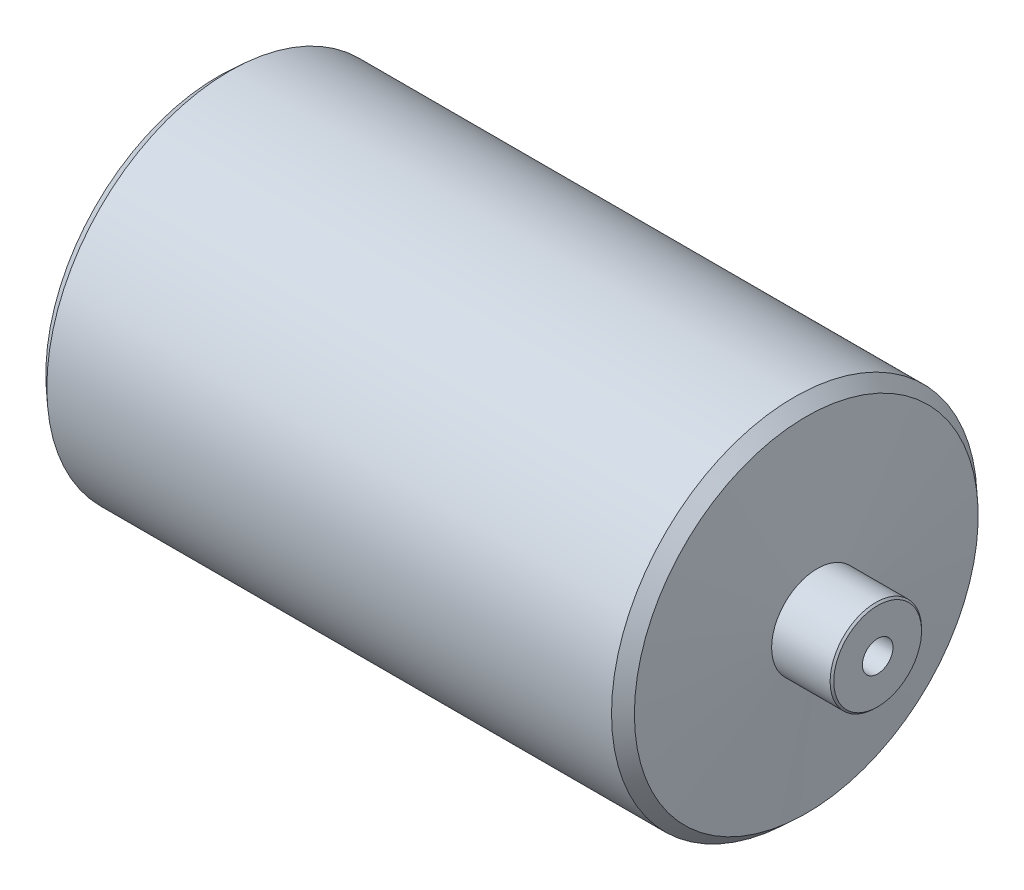
ISO-10303-21;
HEADER;
FILE_DESCRIPTION(('STEP AP214'),'2;1');
FILE_NAME('part.step','',(''),(''),'','','');
FILE_SCHEMA(('AUTOMOTIVE_DESIGN { 1 0 10303 214 1 1 1 1 }'));
ENDSEC;
DATA;
#1=APPLICATION_CONTEXT('core data for automotive mechanical design processes');
#2=APPLICATION_PROTOCOL_DEFINITION('international standard','automotive_design',2000,#1);
#3=PRODUCT_CONTEXT('',#1,'mechanical');
#4=PRODUCT('Part','Part','',(#3));
#5=PRODUCT_RELATED_PRODUCT_CATEGORY('part','',(#4));
#6=PRODUCT_DEFINITION_FORMATION('','',#4);
#7=PRODUCT_DEFINITION_CONTEXT('part definition',#1,'design');
#8=PRODUCT_DEFINITION('design','',#6,#7);
#9=PRODUCT_DEFINITION_SHAPE('','',#8);
#10=(LENGTH_UNIT() NAMED_UNIT(*) SI_UNIT(.MILLI.,.METRE.));
#11=(NAMED_UNIT(*) PLANE_ANGLE_UNIT() SI_UNIT($,.RADIAN.));
#12=(NAMED_UNIT(*) SI_UNIT($,.STERADIAN.) SOLID_ANGLE_UNIT());
#13=UNCERTAINTY_MEASURE_WITH_UNIT(LENGTH_MEASURE(1.E-05),#10,'distance_accuracy_value','');
#14=(GEOMETRIC_REPRESENTATION_CONTEXT(3) GLOBAL_UNCERTAINTY_ASSIGNED_CONTEXT((#13)) GLOBAL_UNIT_ASSIGNED_CONTEXT((#10,
#11,#12)) REPRESENTATION_CONTEXT('',''));
#15=CARTESIAN_POINT('',(0.,0.,0.));
#16=DIRECTION('',(0.,0.,1.));
#17=DIRECTION('',(1.,0.,0.));
#18=AXIS2_PLACEMENT_3D('',#15,#16,#17);
#19=CARTESIAN_POINT('',(0.,0.,0.));
#20=DIRECTION('',(1.,0.,0.));
#21=DIRECTION('',(0.,0.,-1.));
#22=AXIS2_PLACEMENT_3D('',#19,#20,#21);
#23=PLANE('',#22);
#24=CARTESIAN_POINT('',(0.,0.,0.));
#25=DIRECTION('',(-1.,0.,0.));
#26=DIRECTION('',(0.,0.,1.));
#27=AXIS2_PLACEMENT_3D('',#24,#25,#26);
#28=CIRCLE('',#27,4.188);
#29=CARTESIAN_POINT('',(0.,0.,4.188));
#30=VERTEX_POINT('',#29);
#31=EDGE_CURVE('E58',#30,#30,#28,.T.);
#32=ORIENTED_EDGE('',*,*,#31,.F.);
#33=EDGE_LOOP('',(#32));
#34=FACE_BOUND('',#33,.T.);
#35=CARTESIAN_POINT('',(0.,0.,0.));
#36=DIRECTION('',(1.,0.,0.));
#37=DIRECTION('',(0.,0.,-1.));
#38=AXIS2_PLACEMENT_3D('',#35,#36,#37);
#39=CIRCLE('',#38,12.);
#40=CARTESIAN_POINT('',(0.,0.,-12.));
#41=VERTEX_POINT('',#40);
#42=EDGE_CURVE('E41',#41,#41,#39,.F.);
#43=ORIENTED_EDGE('',*,*,#42,.T.);
#44=EDGE_LOOP('',(#43));
#45=FACE_BOUND('',#44,.T.);
#46=ADVANCED_FACE('F33',(#34,#45),#23,.F.);
#47=CARTESIAN_POINT('',(0.,0.,0.));
#48=DIRECTION('',(-1.,0.,0.));
#49=DIRECTION('',(0.,0.,1.));
#50=AXIS2_PLACEMENT_3D('',#47,#48,#49);
#51=CYLINDRICAL_SURFACE('',#50,12.5);
#52=CARTESIAN_POINT('',(0.500000000000013,0.,0.));
#53=DIRECTION('',(1.,0.,0.));
#54=DIRECTION('',(0.,0.,-1.));
#55=AXIS2_PLACEMENT_3D('',#52,#53,#54);
#56=CIRCLE('',#55,12.5);
#57=CARTESIAN_POINT('',(0.500000000000013,0.,-12.5));
#58=VERTEX_POINT('',#57);
#59=EDGE_CURVE('E11',#58,#58,#56,.T.);
#60=ORIENTED_EDGE('',*,*,#59,.T.);
#61=EDGE_LOOP('',(#60));
#62=FACE_BOUND('',#61,.T.);
#63=CARTESIAN_POINT('',(16.5,0.,0.));
#64=DIRECTION('',(-1.,0.,0.));
#65=DIRECTION('',(0.,0.,1.));
#66=AXIS2_PLACEMENT_3D('',#63,#64,#65);
#67=CIRCLE('',#66,12.5);
#68=CARTESIAN_POINT('',(16.5,0.,-12.5));
#69=VERTEX_POINT('',#68);
#70=EDGE_CURVE('E71',#69,#69,#67,.T.);
#71=ORIENTED_EDGE('',*,*,#70,.T.);
#72=EDGE_LOOP('',(#71));
#73=FACE_BOUND('',#72,.T.);
#74=ADVANCED_FACE('F108',(#62,#73),#51,.T.);
#75=CARTESIAN_POINT('',(19.7808248822222,0.,0.));
#76=DIRECTION('',(1.,0.,0.));
#77=DIRECTION('',(0.,0.,-1.));
#78=AXIS2_PLACEMENT_3D('',#75,#76,#77);
#79=CONICAL_SURFACE('',#78,50.,1.48352986419518);
#80=CARTESIAN_POINT('',(19.5193576539792,0.,0.));
#81=DIRECTION('',(-1.,0.,0.));
#82=DIRECTION('',(0.,0.,1.));
#83=AXIS2_PLACEMENT_3D('',#80,#81,#82);
#84=CIRCLE('',#83,47.0114159057247);
#85=CARTESIAN_POINT('',(19.5193576539792,0.,-47.0114159057247));
#86=VERTEX_POINT('',#85);
#87=EDGE_CURVE('E83',#86,#86,#84,.T.);
#88=CARTESIAN_POINT('',(19.5193576539792,0.,-47.0114159057247));
#89=CARTESIAN_POINT('',(19.4879060117503,0.,-46.6519219900401));
#90=CARTESIAN_POINT('',(19.4564543695213,0.,-46.2924280743555));
#91=CARTESIAN_POINT('',(19.3935510850634,0.,-45.5734402429862));
#92=CARTESIAN_POINT('',(19.3620994428345,0.,-45.2139463273016));
#93=CARTESIAN_POINT('',(19.2991961583766,0.,-44.4949584959323));
#94=CARTESIAN_POINT('',(19.2677445161476,0.,-44.1354645802477));
#95=CARTESIAN_POINT('',(19.2048412316897,0.,-43.4164767488784));
#96=CARTESIAN_POINT('',(19.1733895894608,0.,-43.0569828331938));
#97=CARTESIAN_POINT('',(19.1104863050029,0.,-42.3379950018245));
#98=CARTESIAN_POINT('',(19.0790346627739,0.,-41.9785010861399));
#99=CARTESIAN_POINT('',(19.016131378316,0.,-41.2595132547706));
#100=CARTESIAN_POINT('',(18.9846797360871,0.,-40.900019339086));
#101=CARTESIAN_POINT('',(18.9217764516292,0.,-40.1810315077167));
#102=CARTESIAN_POINT('',(18.8903248094002,0.,-39.8215375920321));
#103=CARTESIAN_POINT('',(18.8274215249423,0.,-39.1025497606628));
#104=CARTESIAN_POINT('',(18.7959698827134,0.,-38.7430558449782));
#105=CARTESIAN_POINT('',(18.7330665982555,0.,-38.0240680136089));
#106=CARTESIAN_POINT('',(18.7016149560265,0.,-37.6645740979243));
#107=CARTESIAN_POINT('',(18.6387116715686,0.,-36.945586266555));
#108=CARTESIAN_POINT('',(18.6072600293397,0.,-36.5860923508704));
#109=CARTESIAN_POINT('',(18.5443567448818,0.,-35.8671045195011));
#110=CARTESIAN_POINT('',(18.5129051026528,0.,-35.5076106038165));
#111=CARTESIAN_POINT('',(18.4500018181949,0.,-34.7886227724472));
#112=CARTESIAN_POINT('',(18.418550175966,0.,-34.4291288567626));
#113=CARTESIAN_POINT('',(18.3556468915081,0.,-33.7101410253933));
#114=CARTESIAN_POINT('',(18.3241952492791,0.,-33.3506471097087));
#115=CARTESIAN_POINT('',(18.2612919648212,0.,-32.6316592783394));
#116=CARTESIAN_POINT('',(18.2298403225923,0.,-32.2721653626548));
#117=CARTESIAN_POINT('',(18.1669370381344,0.,-31.5531775312855));
#118=CARTESIAN_POINT('',(18.1354853959054,0.,-31.1936836156009));
#119=CARTESIAN_POINT('',(18.0725821114475,0.,-30.4746957842316));
#120=CARTESIAN_POINT('',(18.0411304692186,0.,-30.115201868547));
#121=CARTESIAN_POINT('',(17.9782271847607,0.,-29.3962140371777));
#122=CARTESIAN_POINT('',(17.9467755425317,0.,-29.0367201214931));
#123=CARTESIAN_POINT('',(17.8838722580738,0.,-28.3177322901238));
#124=CARTESIAN_POINT('',(17.8524206158449,0.,-27.9582383744392));
#125=CARTESIAN_POINT('',(17.789517331387,0.,-27.2392505430699));
#126=CARTESIAN_POINT('',(17.758065689158,0.,-26.8797566273853));
#127=CARTESIAN_POINT('',(17.6951624047001,0.,-26.160768796016));
#128=CARTESIAN_POINT('',(17.6637107624712,0.,-25.8012748803314));
#129=CARTESIAN_POINT('',(17.6008074780133,0.,-25.0822870489621));
#130=CARTESIAN_POINT('',(17.5693558357843,0.,-24.7227931332775));
#131=CARTESIAN_POINT('',(17.5064525513264,0.,-24.0038053019082));
#132=CARTESIAN_POINT('',(17.4750009090975,0.,-23.6443113862236));
#133=CARTESIAN_POINT('',(17.4120976246396,0.,-22.9253235548543));
#134=CARTESIAN_POINT('',(17.3806459824106,0.,-22.5658296391697));
#135=CARTESIAN_POINT('',(17.3177426979527,0.,-21.8468418078004));
#136=CARTESIAN_POINT('',(17.2862910557238,0.,-21.4873478921158));
#137=CARTESIAN_POINT('',(17.2233877712659,0.,-20.7683600607465));
#138=CARTESIAN_POINT('',(17.1919361290369,0.,-20.4088661450619));
#139=CARTESIAN_POINT('',(17.129032844579,0.,-19.6898783136926));
#140=CARTESIAN_POINT('',(17.0975812023501,0.,-19.330384398008));
#141=CARTESIAN_POINT('',(17.0346779178922,0.,-18.6113965666387));
#142=CARTESIAN_POINT('',(17.0032262756632,0.,-18.2519026509541));
#143=CARTESIAN_POINT('',(16.9403229912053,0.,-17.5329148195848));
#144=CARTESIAN_POINT('',(16.9088713489764,0.,-17.1734209039002));
#145=CARTESIAN_POINT('',(16.8459680645185,0.,-16.4544330725309));
#146=CARTESIAN_POINT('',(16.8145164222895,0.,-16.0949391568463));
#147=CARTESIAN_POINT('',(16.7516131378316,0.,-15.375951325477));
#148=CARTESIAN_POINT('',(16.7201614956027,0.,-15.0164574097924));
#149=CARTESIAN_POINT('',(16.6572582111448,0.,-14.2974695784231));
#150=CARTESIAN_POINT('',(16.6258065689158,0.,-13.9379756627385));
#151=CARTESIAN_POINT('',(16.5629032844579,0.,-13.2189878313692));
#152=CARTESIAN_POINT('',(16.531451642229,0.,-12.8594939156846));
#153=CARTESIAN_POINT('',(16.5,0.,-12.5));
#154=B_SPLINE_CURVE_WITH_KNOTS('',3,(#88,#89,#90,#91,#92,#93,#94,#95,#96,#97,#98,#99,#100,#101,
#102,#103,#104,#105,#106,#107,#108,#109,#110,#111,#112,#113,#114,#115,#116,#117,#118,#119,#120,
#121,#122,#123,#124,#125,#126,#127,#128,#129,#130,#131,#132,#133,#134,#135,#136,#137,#138,#139,
#140,#141,#142,#143,#144,#145,#146,#147,#148,#149,#150,#151,#152,#153),.UNSPECIFIED.,.F.,.F.,(4,
2,2,2,2,2,2,2,2,2,2,2,2,2,2,2,2,2,2,2,2,2,2,2,2,2,2,2,2,2,2,2,4),(0.,1.08260137212111,
2.16520274424222,3.24780411636333,4.33040548848444,5.41300686060555,6.49560823272667,
7.57820960484777,8.66081097696888,9.74341234908999,10.8260137212111,11.9086150933322,
12.9912164654533,14.0738178375744,15.1564192096956,16.2390205818167,17.3216219539378,
18.4042233260589,19.48682469818,20.5694260703011,21.6520274424222,22.7346288145433,
23.8172301866644,24.8998315587855,25.9824329309066,27.0650343030277,28.1476356751489,
29.23023704727,30.3128384193911,31.3954397915122,32.4780411636333,33.5606425357544,
34.6432439078755),.UNSPECIFIED.);
#155=EDGE_CURVE('BSEAM114',#86,#69,#154,.T.);
#156=ORIENTED_EDGE('',*,*,#87,.T.);
#157=ORIENTED_EDGE('',*,*,#70,.F.);
#158=ORIENTED_EDGE('',*,*,#155,.T.);
#159=ORIENTED_EDGE('',*,*,#155,.F.);
#160=EDGE_LOOP('',(#156,#158,#157,#159));
#161=FACE_BOUND('',#160,.T.);
#162=ADVANCED_FACE('F114',(#161),#79,.T.);
#163=CARTESIAN_POINT('',(0.,0.,0.));
#164=DIRECTION('',(-1.,0.,0.));
#165=DIRECTION('',(0.,0.,1.));
#166=AXIS2_PLACEMENT_3D('',#163,#164,#165);
#167=CYLINDRICAL_SURFACE('',#166,50.);
#168=CARTESIAN_POINT('',(177.219175117778,0.,0.));
#169=DIRECTION('',(-1.,0.,0.));
#170=DIRECTION('',(0.,0.,1.));
#171=AXIS2_PLACEMENT_3D('',#168,#169,#170);
#172=CIRCLE('',#171,50.);
#173=CARTESIAN_POINT('',(177.219175117778,0.,50.));
#174=VERTEX_POINT('',#173);
#175=EDGE_CURVE('E77',#174,#174,#172,.T.);
#176=ORIENTED_EDGE('',*,*,#175,.T.);
#177=EDGE_LOOP('',(#176));
#178=FACE_BOUND('',#177,.T.);
#179=CARTESIAN_POINT('',(22.7808248822223,0.,0.));
#180=DIRECTION('',(1.,0.,0.));
#181=DIRECTION('',(0.,0.,-1.));
#182=AXIS2_PLACEMENT_3D('',#179,#180,#181);
#183=CIRCLE('',#182,50.);
#184=CARTESIAN_POINT('',(22.7808248822223,0.,-50.));
#185=VERTEX_POINT('',#184);
#186=EDGE_CURVE('E74',#185,#185,#183,.T.);
#187=ORIENTED_EDGE('',*,*,#186,.T.);
#188=EDGE_LOOP('',(#187));
#189=FACE_BOUND('',#188,.T.);
#190=ADVANCED_FACE('F135',(#178,#189),#167,.T.);
#191=CARTESIAN_POINT('',(183.5,0.,0.));
#192=DIRECTION('',(-1.,0.,0.));
#193=DIRECTION('',(0.,0.,1.));
#194=AXIS2_PLACEMENT_3D('',#191,#192,#193);
#195=CONICAL_SURFACE('',#194,12.5,1.48352986419518);
#196=CARTESIAN_POINT('',(180.480642346021,0.,0.));
#197=DIRECTION('',(1.,0.,0.));
#198=DIRECTION('',(0.,0.,-1.));
#199=AXIS2_PLACEMENT_3D('',#196,#197,#198);
#200=CIRCLE('',#199,47.0114159057248);
#201=CARTESIAN_POINT('',(180.480642346021,0.,47.011415905725));
#202=VERTEX_POINT('',#201);
#203=EDGE_CURVE('E80',#202,#202,#200,.T.);
#204=CARTESIAN_POINT('',(183.5,0.,0.));
#205=DIRECTION('',(-1.,0.,0.));
#206=DIRECTION('',(0.,0.,1.));
#207=AXIS2_PLACEMENT_3D('',#204,#205,#206);
#208=CIRCLE('',#207,12.5);
#209=CARTESIAN_POINT('',(183.5,0.,12.4999999999998));
#210=VERTEX_POINT('',#209);
#211=EDGE_CURVE('E68',#210,#210,#208,.T.);
#212=CARTESIAN_POINT('',(180.480642346021,0.,47.011415905725));
#213=CARTESIAN_POINT('',(180.51209398825,0.,46.6519219900404));
#214=CARTESIAN_POINT('',(180.543545630479,0.,46.2924280743558));
#215=CARTESIAN_POINT('',(180.606448914937,0.,45.5734402429865));
#216=CARTESIAN_POINT('',(180.637900557166,0.,45.2139463273018));
#217=CARTESIAN_POINT('',(180.700803841623,0.,44.4949584959326));
#218=CARTESIAN_POINT('',(180.732255483852,0.,44.1354645802479));
#219=CARTESIAN_POINT('',(180.79515876831,0.,43.4164767488787));
#220=CARTESIAN_POINT('',(180.826610410539,0.,43.056982833194));
#221=CARTESIAN_POINT('',(180.889513694997,0.,42.3379950018248));
#222=CARTESIAN_POINT('',(180.920965337226,0.,41.9785010861401));
#223=CARTESIAN_POINT('',(180.983868621684,0.,41.2595132547708));
#224=CARTESIAN_POINT('',(181.015320263913,0.,40.9000193390862));
#225=CARTESIAN_POINT('',(181.078223548371,0.,40.1810315077169));
#226=CARTESIAN_POINT('',(181.1096751906,0.,39.8215375920323));
#227=CARTESIAN_POINT('',(181.172578475058,0.,39.102549760663));
#228=CARTESIAN_POINT('',(181.204030117287,0.,38.7430558449784));
#229=CARTESIAN_POINT('',(181.266933401745,0.,38.0240680136091));
#230=CARTESIAN_POINT('',(181.298385043974,0.,37.6645740979245));
#231=CARTESIAN_POINT('',(181.361288328431,0.,36.9455862665552));
#232=CARTESIAN_POINT('',(181.39273997066,0.,36.5860923508706));
#233=CARTESIAN_POINT('',(181.455643255118,0.,35.8671045195013));
#234=CARTESIAN_POINT('',(181.487094897347,0.,35.5076106038166));
#235=CARTESIAN_POINT('',(181.549998181805,0.,34.7886227724474));
#236=CARTESIAN_POINT('',(181.581449824034,0.,34.4291288567627));
#237=CARTESIAN_POINT('',(181.644353108492,0.,33.7101410253935));
#238=CARTESIAN_POINT('',(181.675804750721,0.,33.3506471097088));
#239=CARTESIAN_POINT('',(181.738708035179,0.,32.6316592783395));
#240=CARTESIAN_POINT('',(181.770159677408,0.,32.2721653626549));
#241=CARTESIAN_POINT('',(181.833062961866,0.,31.5531775312856));
#242=CARTESIAN_POINT('',(181.864514604095,0.,31.193683615601));
#243=CARTESIAN_POINT('',(181.927417888553,0.,30.4746957842317));
#244=CARTESIAN_POINT('',(181.958869530781,0.,30.1152018685471));
#245=CARTESIAN_POINT('',(182.021772815239,0.,29.3962140371778));
#246=CARTESIAN_POINT('',(182.053224457468,0.,29.0367201214932));
#247=CARTESIAN_POINT('',(182.116127741926,0.,28.3177322901239));
#248=CARTESIAN_POINT('',(182.147579384155,0.,27.9582383744393));
#249=CARTESIAN_POINT('',(182.210482668613,0.,27.23925054307));
#250=CARTESIAN_POINT('',(182.241934310842,0.,26.8797566273853));
#251=CARTESIAN_POINT('',(182.3048375953,0.,26.1607687960161));
#252=CARTESIAN_POINT('',(182.336289237529,0.,25.8012748803314));
#253=CARTESIAN_POINT('',(182.399192521987,0.,25.0822870489622));
#254=CARTESIAN_POINT('',(182.430644164216,0.,24.7227931332775));
#255=CARTESIAN_POINT('',(182.493547448674,0.,24.0038053019082));
#256=CARTESIAN_POINT('',(182.524999090903,0.,23.6443113862236));
#257=CARTESIAN_POINT('',(182.58790237536,0.,22.9253235548543));
#258=CARTESIAN_POINT('',(182.619354017589,0.,22.5658296391697));
#259=CARTESIAN_POINT('',(182.682257302047,0.,21.8468418078004));
#260=CARTESIAN_POINT('',(182.713708944276,0.,21.4873478921158));
#261=CARTESIAN_POINT('',(182.776612228734,0.,20.7683600607465));
#262=CARTESIAN_POINT('',(182.808063870963,0.,20.4088661450619));
#263=CARTESIAN_POINT('',(182.870967155421,0.,19.6898783136926));
#264=CARTESIAN_POINT('',(182.90241879765,0.,19.330384398008));
#265=CARTESIAN_POINT('',(182.965322082108,0.,18.6113965666387));
#266=CARTESIAN_POINT('',(182.996773724337,0.,18.251902650954));
#267=CARTESIAN_POINT('',(183.059677008795,0.,17.5329148195848));
#268=CARTESIAN_POINT('',(183.091128651024,0.,17.1734209039001));
#269=CARTESIAN_POINT('',(183.154031935482,0.,16.4544330725309));
#270=CARTESIAN_POINT('',(183.185483577711,0.,16.0949391568462));
#271=CARTESIAN_POINT('',(183.248386862168,0.,15.3759513254769));
#272=CARTESIAN_POINT('',(183.279838504397,0.,15.0164574097923));
#273=CARTESIAN_POINT('',(183.342741788855,0.,14.297469578423));
#274=CARTESIAN_POINT('',(183.374193431084,0.,13.9379756627384));
#275=CARTESIAN_POINT('',(183.437096715542,0.,13.2189878313691));
#276=CARTESIAN_POINT('',(183.468548357771,0.,12.8594939156845));
#277=CARTESIAN_POINT('',(183.5,0.,12.4999999999998));
#278=B_SPLINE_CURVE_WITH_KNOTS('',3,(#212,#213,#214,#215,#216,#217,#218,#219,#220,#221,#222,
#223,#224,#225,#226,#227,#228,#229,#230,#231,#232,#233,#234,#235,#236,#237,#238,#239,#240,#241,
#242,#243,#244,#245,#246,#247,#248,#249,#250,#251,#252,#253,#254,#255,#256,#257,#258,#259,#260,
#261,#262,#263,#264,#265,#266,#267,#268,#269,#270,#271,#272,#273,#274,#275,#276,#277),
.UNSPECIFIED.,.F.,.F.,(4,2,2,2,2,2,2,2,2,2,2,2,2,2,2,2,2,2,2,2,2,2,2,2,2,2,2,2,2,2,2,2,4),(0.,
1.08260137212112,2.16520274424224,3.24780411636337,4.33040548848449,5.41300686060562,
6.49560823272675,7.57820960484787,8.66081097696899,9.74341234909011,10.8260137212112,
11.9086150933324,12.9912164654535,14.0738178375746,15.1564192096957,16.2390205818169,
17.321621953938,18.4042233260591,19.4868246981802,20.5694260703014,21.6520274424225,
22.7346288145436,23.8172301866647,24.8998315587859,25.982432930907,27.0650343030281,
28.1476356751492,29.2302370472704,30.3128384193915,31.3954397915126,32.4780411636337,
33.5606425357549,34.643243907876),.UNSPECIFIED.);
#279=EDGE_CURVE('BSEAM141',#202,#210,#278,.T.);
#280=ORIENTED_EDGE('',*,*,#203,.T.);
#281=ORIENTED_EDGE('',*,*,#211,.T.);
#282=ORIENTED_EDGE('',*,*,#279,.T.);
#283=ORIENTED_EDGE('',*,*,#279,.F.);
#284=EDGE_LOOP('',(#280,#282,#281,#283));
#285=FACE_BOUND('',#284,.T.);
#286=ADVANCED_FACE('F141',(#285),#195,.T.);
#287=CARTESIAN_POINT('',(0.,0.,0.));
#288=DIRECTION('',(-1.,0.,0.));
#289=DIRECTION('',(0.,0.,1.));
#290=AXIS2_PLACEMENT_3D('',#287,#288,#289);
#291=CYLINDRICAL_SURFACE('',#290,12.5);
#292=CARTESIAN_POINT('',(199.5,0.,0.));
#293=DIRECTION('',(-1.,0.,0.));
#294=DIRECTION('',(0.,0.,1.));
#295=AXIS2_PLACEMENT_3D('',#292,#293,#294);
#296=CIRCLE('',#295,12.5);
#297=CARTESIAN_POINT('',(199.5,0.,12.5));
#298=VERTEX_POINT('',#297);
#299=EDGE_CURVE('E86',#298,#298,#296,.T.);
#300=ORIENTED_EDGE('',*,*,#299,.T.);
#301=EDGE_LOOP('',(#300));
#302=FACE_BOUND('',#301,.T.);
#303=ORIENTED_EDGE('',*,*,#211,.F.);
#304=EDGE_LOOP('',(#303));
#305=FACE_BOUND('',#304,.T.);
#306=ADVANCED_FACE('F147',(#302,#305),#291,.T.);
#307=CARTESIAN_POINT('',(200.,12.5,0.));
#308=DIRECTION('',(-1.,0.,0.));
#309=DIRECTION('',(0.,0.,1.));
#310=AXIS2_PLACEMENT_3D('',#307,#308,#309);
#311=PLANE('',#310);
#312=CARTESIAN_POINT('',(200.,0.,0.));
#313=DIRECTION('',(1.,0.,0.));
#314=DIRECTION('',(0.,0.,-1.));
#315=AXIS2_PLACEMENT_3D('',#312,#313,#314);
#316=CIRCLE('',#315,4.188);
#317=CARTESIAN_POINT('',(200.,0.,-4.188));
#318=VERTEX_POINT('',#317);
#319=EDGE_CURVE('E57',#318,#318,#316,.T.);
#320=ORIENTED_EDGE('',*,*,#319,.F.);
#321=EDGE_LOOP('',(#320));
#322=FACE_BOUND('',#321,.T.);
#323=CARTESIAN_POINT('',(200.,0.,0.));
#324=DIRECTION('',(-1.,0.,0.));
#325=DIRECTION('',(0.,0.,1.));
#326=AXIS2_PLACEMENT_3D('',#323,#324,#325);
#327=CIRCLE('',#326,12.0000000000001);
#328=CARTESIAN_POINT('',(200.,0.,12.0000000000001));
#329=VERTEX_POINT('',#328);
#330=EDGE_CURVE('E89',#329,#329,#327,.F.);
#331=ORIENTED_EDGE('',*,*,#330,.T.);
#332=EDGE_LOOP('',(#331));
#333=FACE_BOUND('',#332,.T.);
#334=ADVANCED_FACE('F123',(#322,#333),#311,.F.);
#335=CARTESIAN_POINT('',(177.219175117778,0.,0.));
#336=DIRECTION('',(-1.,0.,0.));
#337=DIRECTION('',(0.,0.,1.));
#338=AXIS2_PLACEMENT_3D('',#335,#336,#337);
#339=CONICAL_SURFACE('',#338,50.,0.741764932097586);
#340=ORIENTED_EDGE('',*,*,#203,.F.);
#341=EDGE_LOOP('',(#340));
#342=FACE_BOUND('',#341,.T.);
#343=ORIENTED_EDGE('',*,*,#175,.F.);
#344=EDGE_LOOP('',(#343));
#345=FACE_BOUND('',#344,.T.);
#346=ADVANCED_FACE('F120',(#342,#345),#339,.T.);
#347=CARTESIAN_POINT('',(19.5193576539792,0.,0.));
#348=DIRECTION('',(1.,0.,0.));
#349=DIRECTION('',(0.,0.,-1.));
#350=AXIS2_PLACEMENT_3D('',#347,#348,#349);
#351=CONICAL_SURFACE('',#350,47.0114159057247,0.741764932097589);
#352=ORIENTED_EDGE('',*,*,#186,.F.);
#353=EDGE_LOOP('',(#352));
#354=FACE_BOUND('',#353,.T.);
#355=ORIENTED_EDGE('',*,*,#87,.F.);
#356=EDGE_LOOP('',(#355));
#357=FACE_BOUND('',#356,.T.);
#358=ADVANCED_FACE('F104',(#354,#357),#351,.T.);
#359=CARTESIAN_POINT('',(199.5,0.,0.));
#360=DIRECTION('',(-1.,0.,0.));
#361=DIRECTION('',(0.,0.,1.));
#362=AXIS2_PLACEMENT_3D('',#359,#360,#361);
#363=CONICAL_SURFACE('',#362,12.5,0.78539816339744);
#364=ORIENTED_EDGE('',*,*,#330,.F.);
#365=EDGE_LOOP('',(#364));
#366=FACE_BOUND('',#365,.T.);
#367=ORIENTED_EDGE('',*,*,#299,.F.);
#368=EDGE_LOOP('',(#367));
#369=FACE_BOUND('',#368,.T.);
#370=ADVANCED_FACE('F97',(#366,#369),#363,.T.);
#371=CARTESIAN_POINT('',(0.,0.,0.));
#372=DIRECTION('',(1.,0.,0.));
#373=DIRECTION('',(0.,0.,-1.));
#374=AXIS2_PLACEMENT_3D('',#371,#372,#373);
#375=CONICAL_SURFACE('',#374,12.,0.78539816339746);
#376=ORIENTED_EDGE('',*,*,#59,.F.);
#377=EDGE_LOOP('',(#376));
#378=FACE_BOUND('',#377,.T.);
#379=ORIENTED_EDGE('',*,*,#42,.F.);
#380=EDGE_LOOP('',(#379));
#381=FACE_BOUND('',#380,.T.);
#382=ADVANCED_FACE('F35',(#378,#381),#375,.T.);
#383=CARTESIAN_POINT('',(141.,0.,0.));
#384=DIRECTION('',(1.,0.,0.));
#385=DIRECTION('',(0.,0.,-1.));
#386=AXIS2_PLACEMENT_3D('',#383,#384,#385);
#387=CONICAL_SURFACE('',#386,4.18799999999999,1.02974425867665);
#388=CARTESIAN_POINT('',(138.483595727513,0.,0.));
#389=VERTEX_POINT('',#388);
#390=VERTEX_LOOP('',#389);
#391=FACE_BOUND('',#390,.T.);
#392=CARTESIAN_POINT('',(141.,0.,0.));
#393=DIRECTION('',(1.,0.,0.));
#394=DIRECTION('',(0.,0.,-1.));
#395=AXIS2_PLACEMENT_3D('',#392,#393,#394);
#396=CIRCLE('',#395,4.18799999999999);
#397=CARTESIAN_POINT('',(141.,0.,-4.18799999999999));
#398=VERTEX_POINT('',#397);
#399=EDGE_CURVE('E61',#398,#398,#396,.T.);
#400=ORIENTED_EDGE('',*,*,#399,.T.);
#401=EDGE_LOOP('',(#400));
#402=FACE_BOUND('',#401,.T.);
#403=ADVANCED_FACE('F96',(#391,#402),#387,.F.);
#404=CARTESIAN_POINT('',(200.,0.,0.));
#405=DIRECTION('',(1.,0.,0.));
#406=DIRECTION('',(0.,0.,-1.));
#407=AXIS2_PLACEMENT_3D('',#404,#405,#406);
#408=CYLINDRICAL_SURFACE('',#407,4.188);
#409=ORIENTED_EDGE('',*,*,#399,.F.);
#410=EDGE_LOOP('',(#409));
#411=FACE_BOUND('',#410,.T.);
#412=ORIENTED_EDGE('',*,*,#319,.T.);
#413=EDGE_LOOP('',(#412));
#414=FACE_BOUND('',#413,.T.);
#415=ADVANCED_FACE('F51',(#411,#414),#408,.F.);
#416=CARTESIAN_POINT('',(59.,0.,0.));
#417=DIRECTION('',(-1.,0.,0.));
#418=DIRECTION('',(0.,0.,1.));
#419=AXIS2_PLACEMENT_3D('',#416,#417,#418);
#420=CONICAL_SURFACE('',#419,4.18799999999999,1.02974425867665);
#421=CARTESIAN_POINT('',(61.5164042724874,0.,0.));
#422=VERTEX_POINT('',#421);
#423=VERTEX_LOOP('',#422);
#424=FACE_BOUND('',#423,.T.);
#425=CARTESIAN_POINT('',(59.,0.,0.));
#426=DIRECTION('',(-1.,0.,0.));
#427=DIRECTION('',(0.,0.,1.));
#428=AXIS2_PLACEMENT_3D('',#425,#426,#427);
#429=CIRCLE('',#428,4.18799999999999);
#430=CARTESIAN_POINT('',(59.,0.,4.18799999999999));
#431=VERTEX_POINT('',#430);
#432=EDGE_CURVE('E55',#431,#431,#429,.T.);
#433=ORIENTED_EDGE('',*,*,#432,.T.);
#434=EDGE_LOOP('',(#433));
#435=FACE_BOUND('',#434,.T.);
#436=ADVANCED_FACE('F47',(#424,#435),#420,.F.);
#437=CARTESIAN_POINT('',(0.,0.,0.));
#438=DIRECTION('',(-1.,0.,0.));
#439=DIRECTION('',(0.,0.,1.));
#440=AXIS2_PLACEMENT_3D('',#437,#438,#439);
#441=CYLINDRICAL_SURFACE('',#440,4.188);
#442=ORIENTED_EDGE('',*,*,#432,.F.);
#443=EDGE_LOOP('',(#442));
#444=FACE_BOUND('',#443,.T.);
#445=ORIENTED_EDGE('',*,*,#31,.T.);
#446=EDGE_LOOP('',(#445));
#447=FACE_BOUND('',#446,.T.);
#448=ADVANCED_FACE('F50',(#444,#447),#441,.F.);
#449=CLOSED_SHELL('',(#46,#74,#162,#190,#286,#306,#334,#346,#358,#370,#382,#403,#415,#436,#448));
#450=MANIFOLD_SOLID_BREP('B2',#449);
#451=ADVANCED_BREP_SHAPE_REPRESENTATION('',(#18,#450),#14);
#452=SHAPE_DEFINITION_REPRESENTATION(#9,#451);
ENDSEC;
END-ISO-10303-21;
